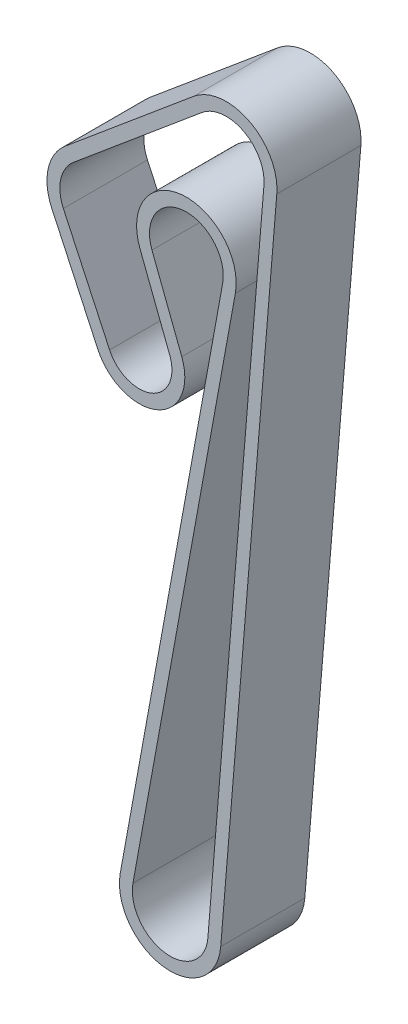
ISO-10303-21;
HEADER;
FILE_DESCRIPTION(('STEP AP214'),'2;1');
FILE_NAME('part.step','',(''),(''),'','','');
FILE_SCHEMA(('AUTOMOTIVE_DESIGN { 1 0 10303 214 1 1 1 1 }'));
ENDSEC;
DATA;
#1=APPLICATION_CONTEXT('core data for automotive mechanical design processes');
#2=APPLICATION_PROTOCOL_DEFINITION('international standard','automotive_design',2000,#1);
#3=PRODUCT_CONTEXT('',#1,'mechanical');
#4=PRODUCT('Part','Part','',(#3));
#5=PRODUCT_RELATED_PRODUCT_CATEGORY('part','',(#4));
#6=PRODUCT_DEFINITION_FORMATION('','',#4);
#7=PRODUCT_DEFINITION_CONTEXT('part definition',#1,'design');
#8=PRODUCT_DEFINITION('design','',#6,#7);
#9=PRODUCT_DEFINITION_SHAPE('','',#8);
#10=(LENGTH_UNIT() NAMED_UNIT(*) SI_UNIT(.MILLI.,.METRE.));
#11=(NAMED_UNIT(*) PLANE_ANGLE_UNIT() SI_UNIT($,.RADIAN.));
#12=(NAMED_UNIT(*) SI_UNIT($,.STERADIAN.) SOLID_ANGLE_UNIT());
#13=UNCERTAINTY_MEASURE_WITH_UNIT(LENGTH_MEASURE(1.E-05),#10,'distance_accuracy_value','');
#14=(GEOMETRIC_REPRESENTATION_CONTEXT(3) GLOBAL_UNCERTAINTY_ASSIGNED_CONTEXT((#13)) GLOBAL_UNIT_ASSIGNED_CONTEXT((#10,
#11,#12)) REPRESENTATION_CONTEXT('',''));
#15=CARTESIAN_POINT('',(0.,0.,0.));
#16=DIRECTION('',(0.,0.,1.));
#17=DIRECTION('',(1.,0.,0.));
#18=AXIS2_PLACEMENT_3D('',#15,#16,#17);
#19=CARTESIAN_POINT('',(17.0566896246943,83.,9.));
#20=DIRECTION('',(0.,0.,-1.));
#21=DIRECTION('',(-1.,0.,0.));
#22=AXIS2_PLACEMENT_3D('',#19,#20,#21);
#23=CYLINDRICAL_SURFACE('',#22,4.05);
#24=CARTESIAN_POINT('',(17.0566896246943,83.,0.));
#25=DIRECTION('',(0.,0.,1.));
#26=DIRECTION('',(1.,0.,0.));
#27=AXIS2_PLACEMENT_3D('',#24,#25,#26);
#28=CIRCLE('',#27,4.05);
#29=CARTESIAN_POINT('',(21.0929839514263,82.6670914419983,0.));
#30=VERTEX_POINT('',#29);
#31=CARTESIAN_POINT('',(14.4592790918921,86.1074038237873,0.));
#32=VERTEX_POINT('',#31);
#33=EDGE_CURVE('E230',#30,#32,#28,.T.);
#34=ORIENTED_EDGE('',*,*,#33,.F.);
#35=DIRECTION('',(0.,0.,-1.));
#36=VECTOR('',#35,1.);
#37=CARTESIAN_POINT('',(21.0929839514263,82.6670914419983,9.));
#38=LINE('',#37,#36);
#39=CARTESIAN_POINT('',(21.0929839514263,82.6670914419983,9.));
#40=VERTEX_POINT('',#39);
#41=EDGE_CURVE('E11',#40,#30,#38,.T.);
#42=ORIENTED_EDGE('',*,*,#41,.F.);
#43=CARTESIAN_POINT('',(17.0566896246943,83.,9.));
#44=DIRECTION('',(0.,0.,1.));
#45=DIRECTION('',(1.,0.,0.));
#46=AXIS2_PLACEMENT_3D('',#43,#44,#45);
#47=CIRCLE('',#46,4.05);
#48=CARTESIAN_POINT('',(14.4592790918921,86.1074038237873,9.));
#49=VERTEX_POINT('',#48);
#50=EDGE_CURVE('E335',#40,#49,#47,.T.);
#51=ORIENTED_EDGE('',*,*,#50,.T.);
#52=DIRECTION('',(0.,0.,-1.));
#53=VECTOR('',#52,1.);
#54=CARTESIAN_POINT('',(14.4592790918921,86.1074038237873,9.));
#55=LINE('',#54,#53);
#56=EDGE_CURVE('E54',#49,#32,#55,.T.);
#57=ORIENTED_EDGE('',*,*,#56,.T.);
#58=EDGE_LOOP('',(#34,#42,#51,#57));
#59=FACE_BOUND('',#58,.T.);
#60=ADVANCED_FACE('F35',(#59),#23,.F.);
#61=CARTESIAN_POINT('',(14.1782535548242,-1.16940479653789,9.));
#62=DIRECTION('',(-0.996615883143713,0.0821996439510389,0.));
#63=DIRECTION('',(-0.0821996439510389,-0.996615883143713,0.));
#64=AXIS2_PLACEMENT_3D('',#61,#62,#63);
#65=PLANE('',#64);
#66=DIRECTION('',(0.0821996439510389,0.996615883143713,0.));
#67=VECTOR('',#66,1.);
#68=CARTESIAN_POINT('',(14.1782535548242,-1.16940479653789,0.));
#69=LINE('',#68,#67);
#70=CARTESIAN_POINT('',(15.0929839514263,9.92109144199829,0.));
#71=VERTEX_POINT('',#70);
#72=EDGE_CURVE('E232',#71,#30,#69,.T.);
#73=ORIENTED_EDGE('',*,*,#72,.F.);
#74=DIRECTION('',(0.,0.,-1.));
#75=VECTOR('',#74,1.);
#76=CARTESIAN_POINT('',(15.0929839514263,9.92109144199829,9.));
#77=LINE('',#76,#75);
#78=CARTESIAN_POINT('',(15.0929839514263,9.92109144199829,9.));
#79=VERTEX_POINT('',#78);
#80=EDGE_CURVE('E45',#79,#71,#77,.T.);
#81=ORIENTED_EDGE('',*,*,#80,.F.);
#82=DIRECTION('',(0.0821996439510389,0.996615883143713,0.));
#83=VECTOR('',#82,1.);
#84=CARTESIAN_POINT('',(14.1782535548242,-1.16940479653789,9.));
#85=LINE('',#84,#83);
#86=EDGE_CURVE('E337',#79,#40,#85,.T.);
#87=ORIENTED_EDGE('',*,*,#86,.T.);
#88=ORIENTED_EDGE('',*,*,#41,.T.);
#89=EDGE_LOOP('',(#73,#81,#87,#88));
#90=FACE_BOUND('',#89,.T.);
#91=ADVANCED_FACE('F370',(#90),#65,.T.);
#92=CARTESIAN_POINT('',(11.0566896246943,10.254,9.));
#93=DIRECTION('',(0.,0.,-1.));
#94=DIRECTION('',(-1.,0.,0.));
#95=AXIS2_PLACEMENT_3D('',#92,#93,#94);
#96=CYLINDRICAL_SURFACE('',#95,4.05);
#97=CARTESIAN_POINT('',(11.0566896246943,10.254,0.));
#98=DIRECTION('',(0.,0.,1.));
#99=DIRECTION('',(1.,0.,0.));
#100=AXIS2_PLACEMENT_3D('',#97,#98,#99);
#101=CIRCLE('',#100,4.05);
#102=CARTESIAN_POINT('',(7.07228606164993,10.9799671113759,0.));
#103=VERTEX_POINT('',#102);
#104=EDGE_CURVE('E235',#103,#71,#101,.T.);
#105=ORIENTED_EDGE('',*,*,#104,.F.);
#106=DIRECTION('',(0.,0.,-1.));
#107=VECTOR('',#106,1.);
#108=CARTESIAN_POINT('',(7.07228606164993,10.9799671113759,9.));
#109=LINE('',#108,#107);
#110=CARTESIAN_POINT('',(7.07228606164993,10.9799671113759,9.));
#111=VERTEX_POINT('',#110);
#112=EDGE_CURVE('E266',#111,#103,#109,.T.);
#113=ORIENTED_EDGE('',*,*,#112,.F.);
#114=CARTESIAN_POINT('',(11.0566896246943,10.254,9.));
#115=DIRECTION('',(0.,0.,1.));
#116=DIRECTION('',(1.,0.,0.));
#117=AXIS2_PLACEMENT_3D('',#114,#115,#116);
#118=CIRCLE('',#117,4.05);
#119=EDGE_CURVE('E340',#111,#79,#118,.T.);
#120=ORIENTED_EDGE('',*,*,#119,.T.);
#121=ORIENTED_EDGE('',*,*,#80,.T.);
#122=EDGE_LOOP('',(#105,#113,#120,#121));
#123=FACE_BOUND('',#122,.T.);
#124=ADVANCED_FACE('F375',(#123),#96,.F.);
#125=CARTESIAN_POINT('',(4.90875282765591,-0.894385584784725,9.));
#126=DIRECTION('',(0.983803348899839,-0.179251138611339,0.));
#127=DIRECTION('',(0.179251138611339,0.983803348899839,0.));
#128=AXIS2_PLACEMENT_3D('',#125,#126,#127);
#129=PLANE('',#128);
#130=DIRECTION('',(-0.179251138611339,-0.983803348899839,0.));
#131=VECTOR('',#130,1.);
#132=CARTESIAN_POINT('',(4.90875282765591,-0.894385584784725,0.));
#133=LINE('',#132,#131);
#134=CARTESIAN_POINT('',(18.0353364706988,71.1496585852224,0.));
#135=VERTEX_POINT('',#134);
#136=EDGE_CURVE('E238',#135,#103,#133,.T.);
#137=ORIENTED_EDGE('',*,*,#136,.F.);
#138=DIRECTION('',(0.,0.,-1.));
#139=VECTOR('',#138,1.);
#140=CARTESIAN_POINT('',(18.0353364706988,71.1496585852224,9.));
#141=LINE('',#140,#139);
#142=CARTESIAN_POINT('',(18.0353364706988,71.1496585852224,9.));
#143=VERTEX_POINT('',#142);
#144=EDGE_CURVE('E264',#143,#135,#141,.T.);
#145=ORIENTED_EDGE('',*,*,#144,.F.);
#146=DIRECTION('',(-0.179251138611339,-0.983803348899839,0.));
#147=VECTOR('',#146,1.);
#148=CARTESIAN_POINT('',(4.90875282765591,-0.894385584784725,9.));
#149=LINE('',#148,#147);
#150=EDGE_CURVE('E343',#143,#111,#149,.T.);
#151=ORIENTED_EDGE('',*,*,#150,.T.);
#152=ORIENTED_EDGE('',*,*,#112,.T.);
#153=EDGE_LOOP('',(#137,#145,#151,#152));
#154=FACE_BOUND('',#153,.T.);
#155=ADVANCED_FACE('F423',(#154),#129,.T.);
#156=CARTESIAN_POINT('',(12.7916646210623,72.1050671540209,9.));
#157=DIRECTION('',(0.,0.,-1.));
#158=DIRECTION('',(-1.,0.,0.));
#159=AXIS2_PLACEMENT_3D('',#156,#157,#158);
#160=CYLINDRICAL_SURFACE('',#159,5.33000000000018);
#161=CARTESIAN_POINT('',(12.7916646210623,72.1050671540209,0.));
#162=DIRECTION('',(0.,0.,1.));
#163=DIRECTION('',(1.,0.,0.));
#164=AXIS2_PLACEMENT_3D('',#161,#162,#163);
#165=CIRCLE('',#164,5.33000000000018);
#166=CARTESIAN_POINT('',(7.8178105848483,70.1894273062317,0.));
#167=VERTEX_POINT('',#166);
#168=EDGE_CURVE('E241',#167,#135,#165,.F.);
#169=ORIENTED_EDGE('',*,*,#168,.F.);
#170=DIRECTION('',(0.,0.,-1.));
#171=VECTOR('',#170,1.);
#172=CARTESIAN_POINT('',(7.8178105848483,70.1894273062317,9.));
#173=LINE('',#172,#171);
#174=CARTESIAN_POINT('',(7.8178105848483,70.1894273062317,9.));
#175=VERTEX_POINT('',#174);
#176=EDGE_CURVE('E262',#175,#167,#173,.T.);
#177=ORIENTED_EDGE('',*,*,#176,.F.);
#178=CARTESIAN_POINT('',(12.7916646210623,72.1050671540209,9.));
#179=DIRECTION('',(0.,0.,1.));
#180=DIRECTION('',(1.,0.,0.));
#181=AXIS2_PLACEMENT_3D('',#178,#179,#180);
#182=CIRCLE('',#181,5.33000000000018);
#183=EDGE_CURVE('E346',#175,#143,#182,.F.);
#184=ORIENTED_EDGE('',*,*,#183,.T.);
#185=ORIENTED_EDGE('',*,*,#144,.T.);
#186=EDGE_LOOP('',(#169,#177,#184,#185));
#187=FACE_BOUND('',#186,.T.);
#188=ADVANCED_FACE('F419',(#187),#160,.T.);
#189=CARTESIAN_POINT('',(30.3489174532815,11.6886412804803,9.));
#190=DIRECTION('',(-0.933180869833762,-0.359407100898554,0.));
#191=DIRECTION('',(0.359407100898554,-0.933180869833762,0.));
#192=AXIS2_PLACEMENT_3D('',#189,#190,#191);
#193=PLANE('',#192);
#194=DIRECTION('',(-0.359407100898554,0.933180869833762,0.));
#195=VECTOR('',#194,1.);
#196=CARTESIAN_POINT('',(30.3489174532815,11.6886412804803,0.));
#197=LINE('',#196,#195);
#198=CARTESIAN_POINT('',(11.0119374844215,61.8960516020481,0.));
#199=VERTEX_POINT('',#198);
#200=EDGE_CURVE('E244',#199,#167,#197,.T.);
#201=ORIENTED_EDGE('',*,*,#200,.F.);
#202=DIRECTION('',(0.,0.,-1.));
#203=VECTOR('',#202,1.);
#204=CARTESIAN_POINT('',(11.0119374844215,61.8960516020481,9.));
#205=LINE('',#204,#203);
#206=CARTESIAN_POINT('',(11.0119374844215,61.8960516020481,9.));
#207=VERTEX_POINT('',#206);
#208=EDGE_CURVE('E260',#207,#199,#205,.T.);
#209=ORIENTED_EDGE('',*,*,#208,.F.);
#210=DIRECTION('',(-0.359407100898554,0.933180869833762,0.));
#211=VECTOR('',#210,1.);
#212=CARTESIAN_POINT('',(30.3489174532815,11.6886412804803,9.));
#213=LINE('',#212,#211);
#214=EDGE_CURVE('E349',#207,#175,#213,.T.);
#215=ORIENTED_EDGE('',*,*,#214,.T.);
#216=ORIENTED_EDGE('',*,*,#176,.T.);
#217=EDGE_LOOP('',(#201,#209,#215,#216));
#218=FACE_BOUND('',#217,.T.);
#219=ADVANCED_FACE('F416',(#218),#193,.T.);
#220=CARTESIAN_POINT('',(7.74487125913346,60.6377673418023,9.));
#221=DIRECTION('',(0.,0.,-1.));
#222=DIRECTION('',(-1.,0.,0.));
#223=AXIS2_PLACEMENT_3D('',#220,#221,#222);
#224=CYLINDRICAL_SURFACE('',#223,3.501);
#225=CARTESIAN_POINT('',(7.74487125913346,60.6377673418023,0.));
#226=DIRECTION('',(0.,0.,1.));
#227=DIRECTION('',(1.,0.,0.));
#228=AXIS2_PLACEMENT_3D('',#225,#226,#227);
#229=CIRCLE('',#228,3.501);
#230=CARTESIAN_POINT('',(4.57037751952647,59.1614237174397,0.));
#231=VERTEX_POINT('',#230);
#232=EDGE_CURVE('E247',#231,#199,#229,.T.);
#233=ORIENTED_EDGE('',*,*,#232,.F.);
#234=DIRECTION('',(0.,0.,-1.));
#235=VECTOR('',#234,1.);
#236=CARTESIAN_POINT('',(4.57037751952647,59.1614237174397,9.));
#237=LINE('',#236,#235);
#238=CARTESIAN_POINT('',(4.57037751952647,59.1614237174397,9.));
#239=VERTEX_POINT('',#238);
#240=EDGE_CURVE('E189',#239,#231,#237,.T.);
#241=ORIENTED_EDGE('',*,*,#240,.F.);
#242=CARTESIAN_POINT('',(7.74487125913346,60.6377673418023,9.));
#243=DIRECTION('',(0.,0.,1.));
#244=DIRECTION('',(1.,0.,0.));
#245=AXIS2_PLACEMENT_3D('',#242,#243,#244);
#246=CIRCLE('',#245,3.501);
#247=EDGE_CURVE('E200',#239,#207,#246,.T.);
#248=ORIENTED_EDGE('',*,*,#247,.T.);
#249=ORIENTED_EDGE('',*,*,#208,.T.);
#250=EDGE_LOOP('',(#233,#241,#248,#249));
#251=FACE_BOUND('',#250,.T.);
#252=ADVANCED_FACE('F353',(#251),#224,.F.);
#253=CARTESIAN_POINT('',(26.3788897331389,12.2678791863374,9.));
#254=DIRECTION('',(0.906739142989715,0.421691980680541,0.));
#255=DIRECTION('',(-0.421691980680541,0.906739142989715,0.));
#256=AXIS2_PLACEMENT_3D('',#253,#254,#255);
#257=PLANE('',#256);
#258=DIRECTION('',(0.421691980680541,-0.906739142989715,0.));
#259=VECTOR('',#258,1.);
#260=CARTESIAN_POINT('',(26.3788897331389,12.2678791863374,0.));
#261=LINE('',#260,#259);
#262=CARTESIAN_POINT('',(-0.373592301805083,69.7921474782439,0.));
#263=VERTEX_POINT('',#262);
#264=EDGE_CURVE('E185',#263,#231,#261,.T.);
#265=ORIENTED_EDGE('',*,*,#264,.F.);
#266=DIRECTION('',(0.,0.,-1.));
#267=VECTOR('',#266,1.);
#268=CARTESIAN_POINT('',(-0.373592301805083,69.7921474782439,9.));
#269=LINE('',#268,#267);
#270=CARTESIAN_POINT('',(-0.373592301805083,69.7921474782439,9.));
#271=VERTEX_POINT('',#270);
#272=EDGE_CURVE('E180',#271,#263,#269,.T.);
#273=ORIENTED_EDGE('',*,*,#272,.F.);
#274=DIRECTION('',(0.421691980680541,-0.906739142989715,0.));
#275=VECTOR('',#274,1.);
#276=CARTESIAN_POINT('',(26.3788897331389,12.2678791863374,9.));
#277=LINE('',#276,#275);
#278=EDGE_CURVE('E183',#271,#239,#277,.T.);
#279=ORIENTED_EDGE('',*,*,#278,.T.);
#280=ORIENTED_EDGE('',*,*,#240,.T.);
#281=EDGE_LOOP('',(#265,#273,#279,#280));
#282=FACE_BOUND('',#281,.T.);
#283=ADVANCED_FACE('F182',(#282),#257,.T.);
#284=CARTESIAN_POINT('',(3.29870122730328,71.5,9.));
#285=DIRECTION('',(0.,0.,-1.));
#286=DIRECTION('',(-1.,0.,0.));
#287=AXIS2_PLACEMENT_3D('',#284,#285,#286);
#288=CYLINDRICAL_SURFACE('',#287,4.05000000000001);
#289=CARTESIAN_POINT('',(3.29870122730328,71.5,0.));
#290=DIRECTION('',(0.,0.,1.));
#291=DIRECTION('',(1.,0.,0.));
#292=AXIS2_PLACEMENT_3D('',#289,#290,#291);
#293=CIRCLE('',#292,4.05000000000001);
#294=CARTESIAN_POINT('',(0.701290694501047,74.6074038237874,0.));
#295=VERTEX_POINT('',#294);
#296=EDGE_CURVE('E251',#295,#263,#293,.T.);
#297=ORIENTED_EDGE('',*,*,#296,.F.);
#298=DIRECTION('',(0.,0.,-1.));
#299=VECTOR('',#298,1.);
#300=CARTESIAN_POINT('',(0.701290694501047,74.6074038237874,9.));
#301=LINE('',#300,#299);
#302=CARTESIAN_POINT('',(0.701290694501047,74.6074038237874,9.));
#303=VERTEX_POINT('',#302);
#304=EDGE_CURVE('E115',#303,#295,#301,.T.);
#305=ORIENTED_EDGE('',*,*,#304,.F.);
#306=CARTESIAN_POINT('',(3.29870122730328,71.5,9.));
#307=DIRECTION('',(0.,0.,1.));
#308=DIRECTION('',(1.,0.,0.));
#309=AXIS2_PLACEMENT_3D('',#306,#307,#308);
#310=CIRCLE('',#309,4.05000000000001);
#311=EDGE_CURVE('E197',#303,#271,#310,.T.);
#312=ORIENTED_EDGE('',*,*,#311,.T.);
#313=ORIENTED_EDGE('',*,*,#272,.T.);
#314=EDGE_LOOP('',(#297,#305,#312,#313));
#315=FACE_BOUND('',#314,.T.);
#316=ADVANCED_FACE('F202',(#315),#288,.F.);
#317=CARTESIAN_POINT('',(31.6367070536521,12.1846230797203,9.));
#318=DIRECTION('',(-0.933180869833762,-0.359407100898554,0.));
#319=DIRECTION('',(0.359407100898554,-0.933180869833762,0.));
#320=AXIS2_PLACEMENT_3D('',#317,#318,#319);
#321=PLANE('',#320);
#322=DIRECTION('',(-0.359407100898554,0.933180869833762,0.));
#323=VECTOR('',#322,1.);
#324=CARTESIAN_POINT('',(31.6367070536521,12.1846230797203,0.));
#325=LINE('',#324,#323);
#326=CARTESIAN_POINT('',(12.2997270847921,62.3920334012881,0.));
#327=VERTEX_POINT('',#326);
#328=CARTESIAN_POINT('',(9.10560018521889,70.6854091054716,0.));
#329=VERTEX_POINT('',#328);
#330=EDGE_CURVE('E209',#327,#329,#325,.T.);
#331=ORIENTED_EDGE('',*,*,#330,.T.);
#332=DIRECTION('',(0.,0.,-1.));
#333=VECTOR('',#332,1.);
#334=CARTESIAN_POINT('',(9.10560018521889,70.6854091054716,9.));
#335=LINE('',#334,#333);
#336=CARTESIAN_POINT('',(9.10560018521889,70.6854091054716,9.));
#337=VERTEX_POINT('',#336);
#338=EDGE_CURVE('E39',#337,#329,#335,.T.);
#339=ORIENTED_EDGE('',*,*,#338,.F.);
#340=DIRECTION('',(-0.359407100898554,0.933180869833762,0.));
#341=VECTOR('',#340,1.);
#342=CARTESIAN_POINT('',(31.6367070536521,12.1846230797203,9.));
#343=LINE('',#342,#341);
#344=CARTESIAN_POINT('',(12.2997270847921,62.3920334012881,9.));
#345=VERTEX_POINT('',#344);
#346=EDGE_CURVE('E256',#345,#337,#343,.T.);
#347=ORIENTED_EDGE('',*,*,#346,.F.);
#348=DIRECTION('',(0.,0.,-1.));
#349=VECTOR('',#348,1.);
#350=CARTESIAN_POINT('',(12.2997270847921,62.3920334012881,9.));
#351=LINE('',#350,#349);
#352=EDGE_CURVE('E205',#345,#327,#351,.T.);
#353=ORIENTED_EDGE('',*,*,#352,.T.);
#354=EDGE_LOOP('',(#331,#339,#347,#353));
#355=FACE_BOUND('',#354,.T.);
#356=ADVANCED_FACE('F37',(#355),#321,.F.);
#357=CARTESIAN_POINT('',(12.7916646210623,72.1050671540209,9.));
#358=DIRECTION('',(0.,0.,-1.));
#359=DIRECTION('',(-1.,0.,0.));
#360=AXIS2_PLACEMENT_3D('',#357,#358,#359);
#361=CYLINDRICAL_SURFACE('',#360,3.95000000000019);
#362=CARTESIAN_POINT('',(12.7916646210623,72.1050671540209,0.));
#363=DIRECTION('',(0.,0.,1.));
#364=DIRECTION('',(1.,0.,0.));
#365=AXIS2_PLACEMENT_3D('',#362,#363,#364);
#366=CIRCLE('',#365,3.95000000000019);
#367=CARTESIAN_POINT('',(16.677687849217,71.3970251565061,0.));
#368=VERTEX_POINT('',#367);
#369=EDGE_CURVE('E212',#329,#368,#366,.F.);
#370=ORIENTED_EDGE('',*,*,#369,.T.);
#371=DIRECTION('',(0.,0.,-1.));
#372=VECTOR('',#371,1.);
#373=CARTESIAN_POINT('',(16.677687849217,71.3970251565061,9.));
#374=LINE('',#373,#372);
#375=CARTESIAN_POINT('',(16.677687849217,71.3970251565061,9.));
#376=VERTEX_POINT('',#375);
#377=EDGE_CURVE('E291',#376,#368,#374,.T.);
#378=ORIENTED_EDGE('',*,*,#377,.F.);
#379=CARTESIAN_POINT('',(12.7916646210623,72.1050671540209,9.));
#380=DIRECTION('',(0.,0.,1.));
#381=DIRECTION('',(1.,0.,0.));
#382=AXIS2_PLACEMENT_3D('',#379,#380,#381);
#383=CIRCLE('',#382,3.95000000000019);
#384=EDGE_CURVE('E128',#337,#376,#383,.F.);
#385=ORIENTED_EDGE('',*,*,#384,.F.);
#386=ORIENTED_EDGE('',*,*,#338,.T.);
#387=EDGE_LOOP('',(#370,#378,#385,#386));
#388=FACE_BOUND('',#387,.T.);
#389=ADVANCED_FACE('F297',(#388),#361,.F.);
#390=CARTESIAN_POINT('',(3.55110420617413,-0.647019013501077,9.));
#391=DIRECTION('',(0.983803348899839,-0.179251138611339,0.));
#392=DIRECTION('',(0.179251138611339,0.983803348899839,0.));
#393=AXIS2_PLACEMENT_3D('',#390,#391,#392);
#394=PLANE('',#393);
#395=DIRECTION('',(-0.179251138611339,-0.983803348899839,0.));
#396=VECTOR('',#395,1.);
#397=CARTESIAN_POINT('',(3.55110420617413,-0.647019013501077,0.));
#398=LINE('',#397,#396);
#399=CARTESIAN_POINT('',(5.71463744016815,11.2273336826595,0.));
#400=VERTEX_POINT('',#399);
#401=EDGE_CURVE('E214',#368,#400,#398,.T.);
#402=ORIENTED_EDGE('',*,*,#401,.T.);
#403=DIRECTION('',(0.,0.,-1.));
#404=VECTOR('',#403,1.);
#405=CARTESIAN_POINT('',(5.71463744016815,11.2273336826595,9.));
#406=LINE('',#405,#404);
#407=CARTESIAN_POINT('',(5.71463744016815,11.2273336826595,9.));
#408=VERTEX_POINT('',#407);
#409=EDGE_CURVE('E289',#408,#400,#406,.T.);
#410=ORIENTED_EDGE('',*,*,#409,.F.);
#411=DIRECTION('',(-0.179251138611339,-0.983803348899839,0.));
#412=VECTOR('',#411,1.);
#413=CARTESIAN_POINT('',(3.55110420617413,-0.647019013501077,9.));
#414=LINE('',#413,#412);
#415=EDGE_CURVE('E319',#376,#408,#414,.T.);
#416=ORIENTED_EDGE('',*,*,#415,.F.);
#417=ORIENTED_EDGE('',*,*,#377,.T.);
#418=EDGE_LOOP('',(#402,#410,#416,#417));
#419=FACE_BOUND('',#418,.T.);
#420=ADVANCED_FACE('F310',(#419),#394,.F.);
#421=CARTESIAN_POINT('',(11.0566896246943,10.254,9.));
#422=DIRECTION('',(0.,0.,-1.));
#423=DIRECTION('',(-1.,0.,0.));
#424=AXIS2_PLACEMENT_3D('',#421,#422,#423);
#425=CYLINDRICAL_SURFACE('',#424,5.43);
#426=CARTESIAN_POINT('',(11.0566896246943,10.254,0.));
#427=DIRECTION('',(0.,0.,1.));
#428=DIRECTION('',(1.,0.,0.));
#429=AXIS2_PLACEMENT_3D('',#426,#427,#428);
#430=CIRCLE('',#429,5.43);
#431=CARTESIAN_POINT('',(16.4683138701646,9.80765593334586,0.));
#432=VERTEX_POINT('',#431);
#433=EDGE_CURVE('E216',#400,#432,#430,.T.);
#434=ORIENTED_EDGE('',*,*,#433,.T.);
#435=DIRECTION('',(0.,0.,-1.));
#436=VECTOR('',#435,1.);
#437=CARTESIAN_POINT('',(16.4683138701646,9.80765593334586,9.));
#438=LINE('',#437,#436);
#439=CARTESIAN_POINT('',(16.4683138701646,9.80765593334586,9.));
#440=VERTEX_POINT('',#439);
#441=EDGE_CURVE('E286',#440,#432,#438,.T.);
#442=ORIENTED_EDGE('',*,*,#441,.F.);
#443=CARTESIAN_POINT('',(11.0566896246943,10.254,9.));
#444=DIRECTION('',(0.,0.,1.));
#445=DIRECTION('',(1.,0.,0.));
#446=AXIS2_PLACEMENT_3D('',#443,#444,#445);
#447=CIRCLE('',#446,5.43);
#448=EDGE_CURVE('E315',#408,#440,#447,.T.);
#449=ORIENTED_EDGE('',*,*,#448,.F.);
#450=ORIENTED_EDGE('',*,*,#409,.T.);
#451=EDGE_LOOP('',(#434,#442,#449,#450));
#452=FACE_BOUND('',#451,.T.);
#453=ADVANCED_FACE('F313',(#452),#425,.T.);
#454=CARTESIAN_POINT('',(15.5535834735625,-1.28284030519032,9.));
#455=DIRECTION('',(-0.996615883143713,0.0821996439510389,0.));
#456=DIRECTION('',(-0.0821996439510389,-0.996615883143713,0.));
#457=AXIS2_PLACEMENT_3D('',#454,#455,#456);
#458=PLANE('',#457);
#459=DIRECTION('',(0.0821996439510389,0.996615883143713,0.));
#460=VECTOR('',#459,1.);
#461=CARTESIAN_POINT('',(15.5535834735625,-1.28284030519032,0.));
#462=LINE('',#461,#460);
#463=CARTESIAN_POINT('',(22.4683138701646,82.5536559333459,0.));
#464=VERTEX_POINT('',#463);
#465=EDGE_CURVE('E218',#432,#464,#462,.T.);
#466=ORIENTED_EDGE('',*,*,#465,.T.);
#467=DIRECTION('',(0.,0.,-1.));
#468=VECTOR('',#467,1.);
#469=CARTESIAN_POINT('',(22.4683138701646,82.5536559333459,9.));
#470=LINE('',#469,#468);
#471=CARTESIAN_POINT('',(22.4683138701646,82.5536559333459,9.));
#472=VERTEX_POINT('',#471);
#473=EDGE_CURVE('E283',#472,#464,#470,.T.);
#474=ORIENTED_EDGE('',*,*,#473,.F.);
#475=DIRECTION('',(0.0821996439510389,0.996615883143713,0.));
#476=VECTOR('',#475,1.);
#477=CARTESIAN_POINT('',(15.5535834735625,-1.28284030519032,9.));
#478=LINE('',#477,#476);
#479=EDGE_CURVE('E318',#440,#472,#478,.T.);
#480=ORIENTED_EDGE('',*,*,#479,.F.);
#481=ORIENTED_EDGE('',*,*,#441,.T.);
#482=EDGE_LOOP('',(#466,#474,#480,#481));
#483=FACE_BOUND('',#482,.T.);
#484=ADVANCED_FACE('F394',(#483),#458,.F.);
#485=CARTESIAN_POINT('',(17.0566896246943,83.,9.));
#486=DIRECTION('',(0.,0.,-1.));
#487=DIRECTION('',(-1.,0.,0.));
#488=AXIS2_PLACEMENT_3D('',#485,#486,#487);
#489=CYLINDRICAL_SURFACE('',#488,5.43);
#490=CARTESIAN_POINT('',(17.0566896246943,83.,0.));
#491=DIRECTION('',(0.,0.,1.));
#492=DIRECTION('',(1.,0.,0.));
#493=AXIS2_PLACEMENT_3D('',#490,#491,#492);
#494=CIRCLE('',#493,5.43);
#495=CARTESIAN_POINT('',(13.5742355029372,87.1662229044853,0.));
#496=VERTEX_POINT('',#495);
#497=EDGE_CURVE('E220',#464,#496,#494,.T.);
#498=ORIENTED_EDGE('',*,*,#497,.T.);
#499=DIRECTION('',(0.,0.,-1.));
#500=VECTOR('',#499,1.);
#501=CARTESIAN_POINT('',(13.5742355029372,87.1662229044853,9.));
#502=LINE('',#501,#500);
#503=CARTESIAN_POINT('',(13.5742355029372,87.1662229044853,9.));
#504=VERTEX_POINT('',#503);
#505=EDGE_CURVE('E280',#504,#496,#502,.T.);
#506=ORIENTED_EDGE('',*,*,#505,.F.);
#507=CARTESIAN_POINT('',(17.0566896246943,83.,9.));
#508=DIRECTION('',(0.,0.,1.));
#509=DIRECTION('',(1.,0.,0.));
#510=AXIS2_PLACEMENT_3D('',#507,#508,#509);
#511=CIRCLE('',#510,5.43);
#512=EDGE_CURVE('E321',#472,#504,#511,.T.);
#513=ORIENTED_EDGE('',*,*,#512,.F.);
#514=ORIENTED_EDGE('',*,*,#473,.T.);
#515=EDGE_LOOP('',(#498,#506,#513,#514));
#516=FACE_BOUND('',#515,.T.);
#517=ADVANCED_FACE('F390',(#516),#489,.T.);
#518=CARTESIAN_POINT('',(-37.3087744995029,44.6342336247861,9.));
#519=DIRECTION('',(0.64133593402524,-0.767260203404278,0.));
#520=DIRECTION('',(0.767260203404278,0.64133593402524,0.));
#521=AXIS2_PLACEMENT_3D('',#518,#519,#520);
#522=PLANE('',#521);
#523=DIRECTION('',(-0.767260203404278,-0.64133593402524,0.));
#524=VECTOR('',#523,1.);
#525=CARTESIAN_POINT('',(-37.3087744995029,44.6342336247861,0.));
#526=LINE('',#525,#524);
#527=CARTESIAN_POINT('',(-0.183752894453777,75.6662229044853,0.));
#528=VERTEX_POINT('',#527);
#529=EDGE_CURVE('E222',#496,#528,#526,.T.);
#530=ORIENTED_EDGE('',*,*,#529,.T.);
#531=DIRECTION('',(0.,0.,-1.));
#532=VECTOR('',#531,1.);
#533=CARTESIAN_POINT('',(-0.183752894453777,75.6662229044853,9.));
#534=LINE('',#533,#532);
#535=CARTESIAN_POINT('',(-0.183752894453777,75.6662229044853,9.));
#536=VERTEX_POINT('',#535);
#537=EDGE_CURVE('E277',#536,#528,#534,.T.);
#538=ORIENTED_EDGE('',*,*,#537,.F.);
#539=DIRECTION('',(-0.767260203404278,-0.64133593402524,0.));
#540=VECTOR('',#539,1.);
#541=CARTESIAN_POINT('',(-37.3087744995029,44.6342336247861,9.));
#542=LINE('',#541,#540);
#543=EDGE_CURVE('E327',#504,#536,#542,.T.);
#544=ORIENTED_EDGE('',*,*,#543,.F.);
#545=ORIENTED_EDGE('',*,*,#505,.T.);
#546=EDGE_LOOP('',(#530,#538,#544,#545));
#547=FACE_BOUND('',#546,.T.);
#548=ADVANCED_FACE('F386',(#547),#522,.F.);
#549=CARTESIAN_POINT('',(3.29870122730328,71.5,9.));
#550=DIRECTION('',(0.,0.,-1.));
#551=DIRECTION('',(-1.,0.,0.));
#552=AXIS2_PLACEMENT_3D('',#549,#550,#551);
#553=CYLINDRICAL_SURFACE('',#552,5.43000000000001);
#554=CARTESIAN_POINT('',(3.29870122730328,71.5,0.));
#555=DIRECTION('',(0.,0.,1.));
#556=DIRECTION('',(1.,0.,0.));
#557=AXIS2_PLACEMENT_3D('',#554,#555,#556);
#558=CIRCLE('',#557,5.43000000000001);
#559=CARTESIAN_POINT('',(-1.62489231913088,69.2102125449047,0.));
#560=VERTEX_POINT('',#559);
#561=EDGE_CURVE('E224',#528,#560,#558,.T.);
#562=ORIENTED_EDGE('',*,*,#561,.T.);
#563=DIRECTION('',(0.,0.,-1.));
#564=VECTOR('',#563,1.);
#565=CARTESIAN_POINT('',(-1.62489231913088,69.2102125449047,9.));
#566=LINE('',#565,#564);
#567=CARTESIAN_POINT('',(-1.62489231913088,69.2102125449047,9.));
#568=VERTEX_POINT('',#567);
#569=EDGE_CURVE('E274',#568,#560,#566,.T.);
#570=ORIENTED_EDGE('',*,*,#569,.F.);
#571=CARTESIAN_POINT('',(3.29870122730328,71.5,9.));
#572=DIRECTION('',(0.,0.,1.));
#573=DIRECTION('',(1.,0.,0.));
#574=AXIS2_PLACEMENT_3D('',#571,#572,#573);
#575=CIRCLE('',#574,5.43000000000001);
#576=EDGE_CURVE('E329',#536,#568,#575,.T.);
#577=ORIENTED_EDGE('',*,*,#576,.F.);
#578=ORIENTED_EDGE('',*,*,#537,.T.);
#579=EDGE_LOOP('',(#562,#570,#577,#578));
#580=FACE_BOUND('',#579,.T.);
#581=ADVANCED_FACE('F382',(#580),#553,.T.);
#582=CARTESIAN_POINT('',(25.1275897158131,11.6859442529983,9.));
#583=DIRECTION('',(0.906739142989715,0.421691980680541,0.));
#584=DIRECTION('',(-0.421691980680541,0.906739142989715,0.));
#585=AXIS2_PLACEMENT_3D('',#582,#583,#584);
#586=PLANE('',#585);
#587=DIRECTION('',(0.421691980680541,-0.906739142989715,0.));
#588=VECTOR('',#587,1.);
#589=CARTESIAN_POINT('',(25.1275897158131,11.6859442529983,0.));
#590=LINE('',#589,#588);
#591=CARTESIAN_POINT('',(3.31907750220067,58.5794887841006,0.));
#592=VERTEX_POINT('',#591);
#593=EDGE_CURVE('E226',#560,#592,#590,.T.);
#594=ORIENTED_EDGE('',*,*,#593,.T.);
#595=DIRECTION('',(0.,0.,-1.));
#596=VECTOR('',#595,1.);
#597=CARTESIAN_POINT('',(3.31907750220067,58.5794887841006,9.));
#598=LINE('',#597,#596);
#599=CARTESIAN_POINT('',(3.31907750220067,58.5794887841006,9.));
#600=VERTEX_POINT('',#599);
#601=EDGE_CURVE('E271',#600,#592,#598,.T.);
#602=ORIENTED_EDGE('',*,*,#601,.F.);
#603=DIRECTION('',(0.421691980680541,-0.906739142989715,0.));
#604=VECTOR('',#603,1.);
#605=CARTESIAN_POINT('',(25.1275897158131,11.6859442529983,9.));
#606=LINE('',#605,#604);
#607=EDGE_CURVE('E331',#568,#600,#606,.T.);
#608=ORIENTED_EDGE('',*,*,#607,.F.);
#609=ORIENTED_EDGE('',*,*,#569,.T.);
#610=EDGE_LOOP('',(#594,#602,#608,#609));
#611=FACE_BOUND('',#610,.T.);
#612=ADVANCED_FACE('F364',(#611),#586,.F.);
#613=CARTESIAN_POINT('',(7.74487125913346,60.6377673418023,9.));
#614=DIRECTION('',(0.,0.,-1.));
#615=DIRECTION('',(-1.,0.,0.));
#616=AXIS2_PLACEMENT_3D('',#613,#614,#615);
#617=CYLINDRICAL_SURFACE('',#616,4.881);
#618=CARTESIAN_POINT('',(7.74487125913346,60.6377673418023,0.));
#619=DIRECTION('',(0.,0.,1.));
#620=DIRECTION('',(1.,0.,0.));
#621=AXIS2_PLACEMENT_3D('',#618,#619,#620);
#622=CIRCLE('',#621,4.881);
#623=EDGE_CURVE('E228',#592,#327,#622,.T.);
#624=ORIENTED_EDGE('',*,*,#623,.T.);
#625=ORIENTED_EDGE('',*,*,#352,.F.);
#626=CARTESIAN_POINT('',(7.74487125913346,60.6377673418023,9.));
#627=DIRECTION('',(0.,0.,1.));
#628=DIRECTION('',(1.,0.,0.));
#629=AXIS2_PLACEMENT_3D('',#626,#627,#628);
#630=CIRCLE('',#629,4.881);
#631=EDGE_CURVE('E333',#600,#345,#630,.T.);
#632=ORIENTED_EDGE('',*,*,#631,.F.);
#633=ORIENTED_EDGE('',*,*,#601,.T.);
#634=EDGE_LOOP('',(#624,#625,#632,#633));
#635=FACE_BOUND('',#634,.T.);
#636=ADVANCED_FACE('F357',(#635),#617,.T.);
#637=CARTESIAN_POINT('',(-36.4237309105481,43.5754145440881,9.));
#638=DIRECTION('',(0.64133593402524,-0.767260203404278,0.));
#639=DIRECTION('',(0.767260203404278,0.64133593402524,0.));
#640=AXIS2_PLACEMENT_3D('',#637,#638,#639);
#641=PLANE('',#640);
#642=DIRECTION('',(-0.767260203404278,-0.64133593402524,0.));
#643=VECTOR('',#642,1.);
#644=CARTESIAN_POINT('',(-36.4237309105481,43.5754145440881,0.));
#645=LINE('',#644,#643);
#646=EDGE_CURVE('E253',#32,#295,#645,.T.);
#647=ORIENTED_EDGE('',*,*,#646,.F.);
#648=ORIENTED_EDGE('',*,*,#56,.F.);
#649=DIRECTION('',(-0.767260203404278,-0.64133593402524,0.));
#650=VECTOR('',#649,1.);
#651=CARTESIAN_POINT('',(-36.4237309105481,43.5754145440881,9.));
#652=LINE('',#651,#650);
#653=EDGE_CURVE('E203',#49,#303,#652,.T.);
#654=ORIENTED_EDGE('',*,*,#653,.T.);
#655=ORIENTED_EDGE('',*,*,#304,.T.);
#656=EDGE_LOOP('',(#647,#648,#654,#655));
#657=FACE_BOUND('',#656,.T.);
#658=ADVANCED_FACE('F355',(#657),#641,.T.);
#659=CARTESIAN_POINT('',(0.,0.,9.));
#660=DIRECTION('',(0.,0.,1.));
#661=DIRECTION('',(1.,0.,0.));
#662=AXIS2_PLACEMENT_3D('',#659,#660,#661);
#663=PLANE('',#662);
#664=ORIENTED_EDGE('',*,*,#346,.T.);
#665=ORIENTED_EDGE('',*,*,#384,.T.);
#666=ORIENTED_EDGE('',*,*,#415,.T.);
#667=ORIENTED_EDGE('',*,*,#448,.T.);
#668=ORIENTED_EDGE('',*,*,#479,.T.);
#669=ORIENTED_EDGE('',*,*,#512,.T.);
#670=ORIENTED_EDGE('',*,*,#543,.T.);
#671=ORIENTED_EDGE('',*,*,#576,.T.);
#672=ORIENTED_EDGE('',*,*,#607,.T.);
#673=ORIENTED_EDGE('',*,*,#631,.T.);
#674=EDGE_LOOP('',(#664,#665,#666,#667,#668,#669,#670,#671,#672,#673));
#675=FACE_BOUND('',#674,.T.);
#676=ORIENTED_EDGE('',*,*,#50,.F.);
#677=ORIENTED_EDGE('',*,*,#86,.F.);
#678=ORIENTED_EDGE('',*,*,#119,.F.);
#679=ORIENTED_EDGE('',*,*,#150,.F.);
#680=ORIENTED_EDGE('',*,*,#183,.F.);
#681=ORIENTED_EDGE('',*,*,#214,.F.);
#682=ORIENTED_EDGE('',*,*,#247,.F.);
#683=ORIENTED_EDGE('',*,*,#278,.F.);
#684=ORIENTED_EDGE('',*,*,#311,.F.);
#685=ORIENTED_EDGE('',*,*,#653,.F.);
#686=EDGE_LOOP('',(#676,#677,#678,#679,#680,#681,#682,#683,#684,#685));
#687=FACE_BOUND('',#686,.T.);
#688=ADVANCED_FACE('F195',(#675,#687),#663,.T.);
#689=CARTESIAN_POINT('',(0.,0.,0.));
#690=DIRECTION('',(0.,0.,1.));
#691=DIRECTION('',(1.,0.,0.));
#692=AXIS2_PLACEMENT_3D('',#689,#690,#691);
#693=PLANE('',#692);
#694=ORIENTED_EDGE('',*,*,#330,.F.);
#695=ORIENTED_EDGE('',*,*,#623,.F.);
#696=ORIENTED_EDGE('',*,*,#593,.F.);
#697=ORIENTED_EDGE('',*,*,#561,.F.);
#698=ORIENTED_EDGE('',*,*,#529,.F.);
#699=ORIENTED_EDGE('',*,*,#497,.F.);
#700=ORIENTED_EDGE('',*,*,#465,.F.);
#701=ORIENTED_EDGE('',*,*,#433,.F.);
#702=ORIENTED_EDGE('',*,*,#401,.F.);
#703=ORIENTED_EDGE('',*,*,#369,.F.);
#704=EDGE_LOOP('',(#694,#695,#696,#697,#698,#699,#700,#701,#702,#703));
#705=FACE_BOUND('',#704,.T.);
#706=ORIENTED_EDGE('',*,*,#33,.T.);
#707=ORIENTED_EDGE('',*,*,#646,.T.);
#708=ORIENTED_EDGE('',*,*,#296,.T.);
#709=ORIENTED_EDGE('',*,*,#264,.T.);
#710=ORIENTED_EDGE('',*,*,#232,.T.);
#711=ORIENTED_EDGE('',*,*,#200,.T.);
#712=ORIENTED_EDGE('',*,*,#168,.T.);
#713=ORIENTED_EDGE('',*,*,#136,.T.);
#714=ORIENTED_EDGE('',*,*,#104,.T.);
#715=ORIENTED_EDGE('',*,*,#72,.T.);
#716=EDGE_LOOP('',(#706,#707,#708,#709,#710,#711,#712,#713,#714,#715));
#717=FACE_BOUND('',#716,.T.);
#718=ADVANCED_FACE('F304',(#705,#717),#693,.F.);
#719=CLOSED_SHELL('',(#60,#91,#124,#155,#188,#219,#252,#283,#316,#356,#389,#420,#453,#484,#517,
#548,#581,#612,#636,#658,#688,#718));
#720=MANIFOLD_SOLID_BREP('B2',#719);
#721=ADVANCED_BREP_SHAPE_REPRESENTATION('',(#18,#720),#14);
#722=SHAPE_DEFINITION_REPRESENTATION(#9,#721);
ENDSEC;
END-ISO-10303-21;
